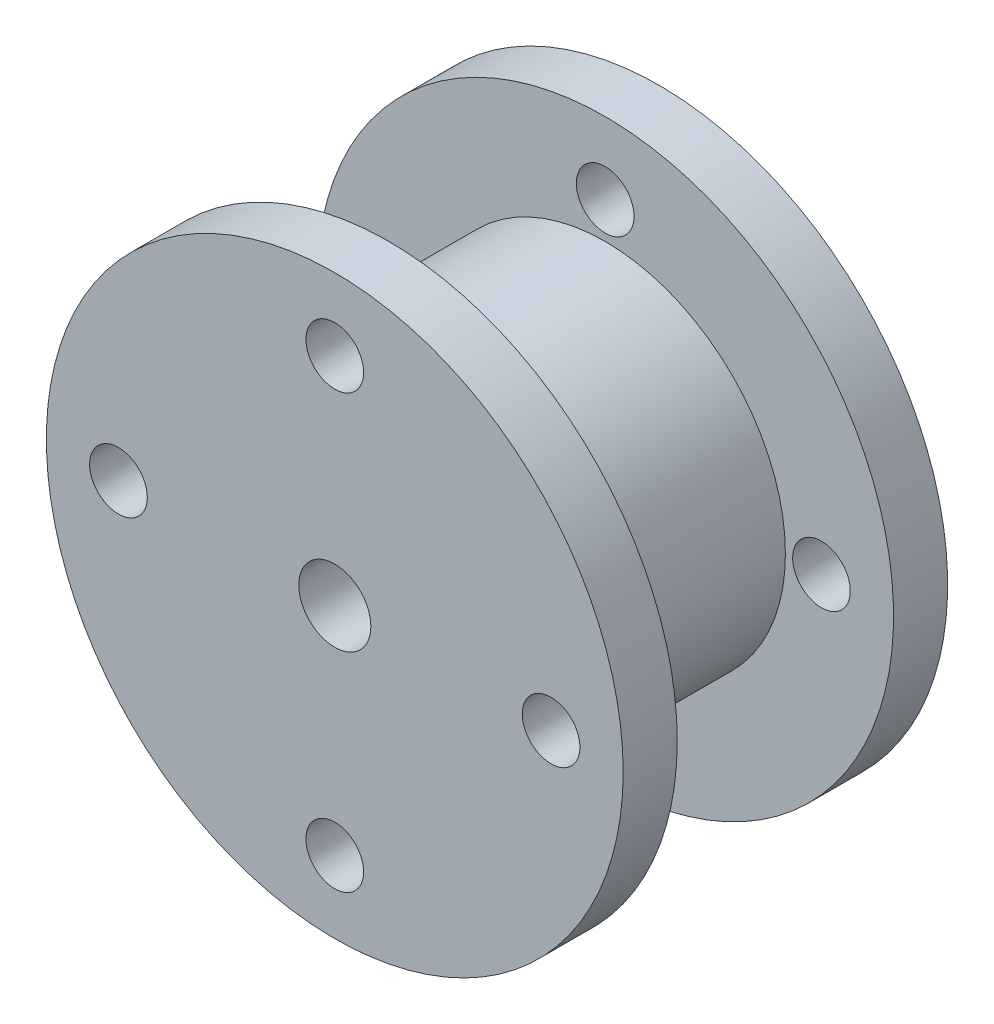
ISO-10303-21;
HEADER;
FILE_DESCRIPTION(('STEP AP214'),'2;1');
FILE_NAME('part.step','',(''),(''),'','','');
FILE_SCHEMA(('AUTOMOTIVE_DESIGN { 1 0 10303 214 1 1 1 1 }'));
ENDSEC;
DATA;
#1=APPLICATION_CONTEXT('core data for automotive mechanical design processes');
#2=APPLICATION_PROTOCOL_DEFINITION('international standard','automotive_design',2000,#1);
#3=PRODUCT_CONTEXT('',#1,'mechanical');
#4=PRODUCT('Part','Part','',(#3));
#5=PRODUCT_RELATED_PRODUCT_CATEGORY('part','',(#4));
#6=PRODUCT_DEFINITION_FORMATION('','',#4);
#7=PRODUCT_DEFINITION_CONTEXT('part definition',#1,'design');
#8=PRODUCT_DEFINITION('design','',#6,#7);
#9=PRODUCT_DEFINITION_SHAPE('','',#8);
#10=(LENGTH_UNIT() NAMED_UNIT(*) SI_UNIT(.MILLI.,.METRE.));
#11=(NAMED_UNIT(*) PLANE_ANGLE_UNIT() SI_UNIT($,.RADIAN.));
#12=(NAMED_UNIT(*) SI_UNIT($,.STERADIAN.) SOLID_ANGLE_UNIT());
#13=UNCERTAINTY_MEASURE_WITH_UNIT(LENGTH_MEASURE(1.E-05),#10,'distance_accuracy_value','');
#14=(GEOMETRIC_REPRESENTATION_CONTEXT(3) GLOBAL_UNCERTAINTY_ASSIGNED_CONTEXT((#13)) GLOBAL_UNIT_ASSIGNED_CONTEXT((#10,
#11,#12)) REPRESENTATION_CONTEXT('',''));
#15=CARTESIAN_POINT('',(0.,0.,0.));
#16=DIRECTION('',(0.,0.,1.));
#17=DIRECTION('',(1.,0.,0.));
#18=AXIS2_PLACEMENT_3D('',#15,#16,#17);
#19=CARTESIAN_POINT('',(0.,0.,6.));
#20=DIRECTION('',(0.,0.,-1.));
#21=DIRECTION('',(-1.,0.,0.));
#22=AXIS2_PLACEMENT_3D('',#19,#20,#21);
#23=CYLINDRICAL_SURFACE('',#22,5.);
#24=CARTESIAN_POINT('',(0.,0.,6.));
#25=DIRECTION('',(0.,0.,1.));
#26=DIRECTION('',(1.,0.,0.));
#27=AXIS2_PLACEMENT_3D('',#24,#25,#26);
#28=CIRCLE('',#27,5.);
#29=CARTESIAN_POINT('',(5.,0.,6.));
#30=VERTEX_POINT('',#29);
#31=EDGE_CURVE('E10',#30,#30,#28,.T.);
#32=ORIENTED_EDGE('',*,*,#31,.F.);
#33=EDGE_LOOP('',(#32));
#34=FACE_BOUND('',#33,.T.);
#35=CARTESIAN_POINT('',(0.,0.,0.));
#36=DIRECTION('',(0.,0.,1.));
#37=DIRECTION('',(1.,0.,0.));
#38=AXIS2_PLACEMENT_3D('',#35,#36,#37);
#39=CIRCLE('',#38,5.);
#40=CARTESIAN_POINT('',(5.,0.,0.));
#41=VERTEX_POINT('',#40);
#42=EDGE_CURVE('E57',#41,#41,#39,.T.);
#43=ORIENTED_EDGE('',*,*,#42,.T.);
#44=EDGE_LOOP('',(#43));
#45=FACE_BOUND('',#44,.T.);
#46=ADVANCED_FACE('F41',(#34,#45),#23,.T.);
#47=CARTESIAN_POINT('',(0.,0.,7.5));
#48=DIRECTION('',(0.,0.,-1.));
#49=DIRECTION('',(-1.,0.,0.));
#50=AXIS2_PLACEMENT_3D('',#47,#48,#49);
#51=CYLINDRICAL_SURFACE('',#50,8.);
#52=CARTESIAN_POINT('',(0.,0.,7.5));
#53=DIRECTION('',(0.,0.,1.));
#54=DIRECTION('',(1.,0.,0.));
#55=AXIS2_PLACEMENT_3D('',#52,#53,#54);
#56=CIRCLE('',#55,8.);
#57=CARTESIAN_POINT('',(8.,0.,7.5));
#58=VERTEX_POINT('',#57);
#59=EDGE_CURVE('E48',#58,#58,#56,.T.);
#60=ORIENTED_EDGE('',*,*,#59,.F.);
#61=EDGE_LOOP('',(#60));
#62=FACE_BOUND('',#61,.T.);
#63=CARTESIAN_POINT('',(0.,0.,6.));
#64=DIRECTION('',(0.,0.,1.));
#65=DIRECTION('',(1.,0.,0.));
#66=AXIS2_PLACEMENT_3D('',#63,#64,#65);
#67=CIRCLE('',#66,8.);
#68=CARTESIAN_POINT('',(8.,0.,6.));
#69=VERTEX_POINT('',#68);
#70=EDGE_CURVE('E53',#69,#69,#67,.T.);
#71=ORIENTED_EDGE('',*,*,#70,.T.);
#72=EDGE_LOOP('',(#71));
#73=FACE_BOUND('',#72,.T.);
#74=ADVANCED_FACE('F123',(#62,#73),#51,.T.);
#75=CARTESIAN_POINT('',(0.,0.,7.5));
#76=DIRECTION('',(0.,0.,1.));
#77=DIRECTION('',(1.,0.,0.));
#78=AXIS2_PLACEMENT_3D('',#75,#76,#77);
#79=PLANE('',#78);
#80=CARTESIAN_POINT('',(0.,0.,7.5));
#81=DIRECTION('',(0.,0.,1.));
#82=DIRECTION('',(1.,0.,0.));
#83=AXIS2_PLACEMENT_3D('',#80,#81,#82);
#84=CIRCLE('',#83,1.);
#85=CARTESIAN_POINT('',(1.,0.,7.5));
#86=VERTEX_POINT('',#85);
#87=EDGE_CURVE('E278',#86,#86,#84,.T.);
#88=ORIENTED_EDGE('',*,*,#87,.F.);
#89=EDGE_LOOP('',(#88));
#90=FACE_BOUND('',#89,.T.);
#91=CARTESIAN_POINT('',(-6.,0.,7.5));
#92=DIRECTION('',(0.,0.,1.));
#93=DIRECTION('',(1.,0.,0.));
#94=AXIS2_PLACEMENT_3D('',#91,#92,#93);
#95=CIRCLE('',#94,0.800000000000001);
#96=CARTESIAN_POINT('',(-5.2,0.,7.5));
#97=VERTEX_POINT('',#96);
#98=EDGE_CURVE('E92',#97,#97,#95,.T.);
#99=ORIENTED_EDGE('',*,*,#98,.F.);
#100=EDGE_LOOP('',(#99));
#101=FACE_BOUND('',#100,.T.);
#102=CARTESIAN_POINT('',(6.,0.,7.5));
#103=DIRECTION('',(0.,0.,1.));
#104=DIRECTION('',(1.,0.,0.));
#105=AXIS2_PLACEMENT_3D('',#102,#103,#104);
#106=CIRCLE('',#105,0.800000000000001);
#107=CARTESIAN_POINT('',(6.8,0.,7.5));
#108=VERTEX_POINT('',#107);
#109=EDGE_CURVE('E77',#108,#108,#106,.T.);
#110=ORIENTED_EDGE('',*,*,#109,.F.);
#111=EDGE_LOOP('',(#110));
#112=FACE_BOUND('',#111,.T.);
#113=CARTESIAN_POINT('',(0.,6.,7.5));
#114=DIRECTION('',(0.,0.,1.));
#115=DIRECTION('',(1.,0.,0.));
#116=AXIS2_PLACEMENT_3D('',#113,#114,#115);
#117=CIRCLE('',#116,0.8);
#118=CARTESIAN_POINT('',(0.8,6.,7.5));
#119=VERTEX_POINT('',#118);
#120=EDGE_CURVE('E73',#119,#119,#117,.T.);
#121=ORIENTED_EDGE('',*,*,#120,.F.);
#122=EDGE_LOOP('',(#121));
#123=FACE_BOUND('',#122,.T.);
#124=CARTESIAN_POINT('',(0.,-6.,7.5));
#125=DIRECTION('',(0.,0.,1.));
#126=DIRECTION('',(1.,0.,0.));
#127=AXIS2_PLACEMENT_3D('',#124,#125,#126);
#128=CIRCLE('',#127,0.8);
#129=CARTESIAN_POINT('',(0.8,-6.,7.5));
#130=VERTEX_POINT('',#129);
#131=EDGE_CURVE('E69',#130,#130,#128,.T.);
#132=ORIENTED_EDGE('',*,*,#131,.F.);
#133=EDGE_LOOP('',(#132));
#134=FACE_BOUND('',#133,.T.);
#135=ORIENTED_EDGE('',*,*,#59,.T.);
#136=EDGE_LOOP('',(#135));
#137=FACE_BOUND('',#136,.T.);
#138=ADVANCED_FACE('F128',(#90,#101,#112,#123,#134,#137),#79,.T.);
#139=CARTESIAN_POINT('',(0.,0.,6.));
#140=DIRECTION('',(0.,0.,1.));
#141=DIRECTION('',(1.,0.,0.));
#142=AXIS2_PLACEMENT_3D('',#139,#140,#141);
#143=PLANE('',#142);
#144=CARTESIAN_POINT('',(-6.,0.,6.));
#145=DIRECTION('',(0.,0.,1.));
#146=DIRECTION('',(1.,0.,0.));
#147=AXIS2_PLACEMENT_3D('',#144,#145,#146);
#148=CIRCLE('',#147,0.800000000000001);
#149=CARTESIAN_POINT('',(-5.2,0.,6.));
#150=VERTEX_POINT('',#149);
#151=EDGE_CURVE('E89',#150,#150,#148,.T.);
#152=ORIENTED_EDGE('',*,*,#151,.T.);
#153=EDGE_LOOP('',(#152));
#154=FACE_BOUND('',#153,.T.);
#155=CARTESIAN_POINT('',(6.,0.,6.));
#156=DIRECTION('',(0.,0.,1.));
#157=DIRECTION('',(1.,0.,0.));
#158=AXIS2_PLACEMENT_3D('',#155,#156,#157);
#159=CIRCLE('',#158,0.800000000000001);
#160=CARTESIAN_POINT('',(6.8,0.,6.));
#161=VERTEX_POINT('',#160);
#162=EDGE_CURVE('E72',#161,#161,#159,.T.);
#163=ORIENTED_EDGE('',*,*,#162,.T.);
#164=EDGE_LOOP('',(#163));
#165=FACE_BOUND('',#164,.T.);
#166=CARTESIAN_POINT('',(0.,6.,6.));
#167=DIRECTION('',(0.,0.,1.));
#168=DIRECTION('',(1.,0.,0.));
#169=AXIS2_PLACEMENT_3D('',#166,#167,#168);
#170=CIRCLE('',#169,0.8);
#171=CARTESIAN_POINT('',(0.8,6.,6.));
#172=VERTEX_POINT('',#171);
#173=EDGE_CURVE('E68',#172,#172,#170,.T.);
#174=ORIENTED_EDGE('',*,*,#173,.T.);
#175=EDGE_LOOP('',(#174));
#176=FACE_BOUND('',#175,.T.);
#177=CARTESIAN_POINT('',(0.,-6.,6.));
#178=DIRECTION('',(0.,0.,1.));
#179=DIRECTION('',(1.,0.,0.));
#180=AXIS2_PLACEMENT_3D('',#177,#178,#179);
#181=CIRCLE('',#180,0.8);
#182=CARTESIAN_POINT('',(0.8,-6.,6.));
#183=VERTEX_POINT('',#182);
#184=EDGE_CURVE('E64',#183,#183,#181,.T.);
#185=ORIENTED_EDGE('',*,*,#184,.T.);
#186=EDGE_LOOP('',(#185));
#187=FACE_BOUND('',#186,.T.);
#188=ORIENTED_EDGE('',*,*,#31,.T.);
#189=EDGE_LOOP('',(#188));
#190=FACE_BOUND('',#189,.T.);
#191=ORIENTED_EDGE('',*,*,#70,.F.);
#192=EDGE_LOOP('',(#191));
#193=FACE_BOUND('',#192,.T.);
#194=ADVANCED_FACE('F137',(#154,#165,#176,#187,#190,#193),#143,.F.);
#195=CARTESIAN_POINT('',(0.,0.,-1.5));
#196=DIRECTION('',(0.,0.,1.));
#197=DIRECTION('',(1.,0.,0.));
#198=AXIS2_PLACEMENT_3D('',#195,#196,#197);
#199=CYLINDRICAL_SURFACE('',#198,8.);
#200=CARTESIAN_POINT('',(0.,0.,-1.5));
#201=DIRECTION('',(0.,0.,-1.));
#202=DIRECTION('',(-1.,0.,0.));
#203=AXIS2_PLACEMENT_3D('',#200,#201,#202);
#204=CIRCLE('',#203,8.);
#205=CARTESIAN_POINT('',(-8.,0.,-1.5));
#206=VERTEX_POINT('',#205);
#207=EDGE_CURVE('E60',#206,#206,#204,.T.);
#208=ORIENTED_EDGE('',*,*,#207,.F.);
#209=EDGE_LOOP('',(#208));
#210=FACE_BOUND('',#209,.T.);
#211=CARTESIAN_POINT('',(0.,0.,0.));
#212=DIRECTION('',(0.,0.,-1.));
#213=DIRECTION('',(-1.,0.,0.));
#214=AXIS2_PLACEMENT_3D('',#211,#212,#213);
#215=CIRCLE('',#214,8.);
#216=CARTESIAN_POINT('',(-8.,0.,0.));
#217=VERTEX_POINT('',#216);
#218=EDGE_CURVE('E95',#217,#217,#215,.T.);
#219=ORIENTED_EDGE('',*,*,#218,.T.);
#220=EDGE_LOOP('',(#219));
#221=FACE_BOUND('',#220,.T.);
#222=ADVANCED_FACE('F101',(#210,#221),#199,.T.);
#223=CARTESIAN_POINT('',(0.,0.,-1.5));
#224=DIRECTION('',(0.,0.,-1.));
#225=DIRECTION('',(-1.,0.,0.));
#226=AXIS2_PLACEMENT_3D('',#223,#224,#225);
#227=PLANE('',#226);
#228=CARTESIAN_POINT('',(0.,0.,-1.5));
#229=DIRECTION('',(0.,0.,1.));
#230=DIRECTION('',(1.,0.,0.));
#231=AXIS2_PLACEMENT_3D('',#228,#229,#230);
#232=CIRCLE('',#231,1.);
#233=CARTESIAN_POINT('',(1.,0.,-1.5));
#234=VERTEX_POINT('',#233);
#235=EDGE_CURVE('E297',#234,#234,#232,.T.);
#236=ORIENTED_EDGE('',*,*,#235,.T.);
#237=EDGE_LOOP('',(#236));
#238=FACE_BOUND('',#237,.T.);
#239=CARTESIAN_POINT('',(-6.,0.,-1.5));
#240=DIRECTION('',(0.,0.,1.));
#241=DIRECTION('',(1.,0.,0.));
#242=AXIS2_PLACEMENT_3D('',#239,#240,#241);
#243=CIRCLE('',#242,0.800000000000001);
#244=CARTESIAN_POINT('',(-5.2,0.,-1.5));
#245=VERTEX_POINT('',#244);
#246=EDGE_CURVE('E65',#245,#245,#243,.T.);
#247=ORIENTED_EDGE('',*,*,#246,.T.);
#248=EDGE_LOOP('',(#247));
#249=FACE_BOUND('',#248,.T.);
#250=CARTESIAN_POINT('',(6.,0.,-1.5));
#251=DIRECTION('',(0.,0.,1.));
#252=DIRECTION('',(-1.,0.,0.));
#253=AXIS2_PLACEMENT_3D('',#250,#251,#252);
#254=CIRCLE('',#253,0.800000000000001);
#255=CARTESIAN_POINT('',(5.2,0.,-1.5));
#256=VERTEX_POINT('',#255);
#257=EDGE_CURVE('E272',#256,#256,#254,.T.);
#258=ORIENTED_EDGE('',*,*,#257,.T.);
#259=EDGE_LOOP('',(#258));
#260=FACE_BOUND('',#259,.T.);
#261=CARTESIAN_POINT('',(0.,6.,-1.5));
#262=DIRECTION('',(0.,0.,1.));
#263=DIRECTION('',(1.,0.,0.));
#264=AXIS2_PLACEMENT_3D('',#261,#262,#263);
#265=CIRCLE('',#264,0.8);
#266=CARTESIAN_POINT('',(0.8,6.,-1.5));
#267=VERTEX_POINT('',#266);
#268=EDGE_CURVE('E265',#267,#267,#265,.T.);
#269=ORIENTED_EDGE('',*,*,#268,.T.);
#270=EDGE_LOOP('',(#269));
#271=FACE_BOUND('',#270,.T.);
#272=CARTESIAN_POINT('',(0.,-6.,-1.5));
#273=DIRECTION('',(0.,0.,1.));
#274=DIRECTION('',(-1.,0.,0.));
#275=AXIS2_PLACEMENT_3D('',#272,#273,#274);
#276=CIRCLE('',#275,0.8);
#277=CARTESIAN_POINT('',(-0.8,-6.,-1.5));
#278=VERTEX_POINT('',#277);
#279=EDGE_CURVE('E273',#278,#278,#276,.T.);
#280=ORIENTED_EDGE('',*,*,#279,.T.);
#281=EDGE_LOOP('',(#280));
#282=FACE_BOUND('',#281,.T.);
#283=ORIENTED_EDGE('',*,*,#207,.T.);
#284=EDGE_LOOP('',(#283));
#285=FACE_BOUND('',#284,.T.);
#286=ADVANCED_FACE('F106',(#238,#249,#260,#271,#282,#285),#227,.T.);
#287=CARTESIAN_POINT('',(0.,0.,0.));
#288=DIRECTION('',(0.,0.,-1.));
#289=DIRECTION('',(-1.,0.,0.));
#290=AXIS2_PLACEMENT_3D('',#287,#288,#289);
#291=PLANE('',#290);
#292=CARTESIAN_POINT('',(-6.,0.,0.));
#293=DIRECTION('',(0.,0.,-1.));
#294=DIRECTION('',(-1.,0.,0.));
#295=AXIS2_PLACEMENT_3D('',#292,#293,#294);
#296=CIRCLE('',#295,0.800000000000001);
#297=CARTESIAN_POINT('',(-6.8,0.,0.));
#298=VERTEX_POINT('',#297);
#299=EDGE_CURVE('E44',#298,#298,#296,.T.);
#300=ORIENTED_EDGE('',*,*,#299,.T.);
#301=EDGE_LOOP('',(#300));
#302=FACE_BOUND('',#301,.T.);
#303=CARTESIAN_POINT('',(6.,0.,0.));
#304=DIRECTION('',(0.,0.,-1.));
#305=DIRECTION('',(-1.,0.,0.));
#306=AXIS2_PLACEMENT_3D('',#303,#304,#305);
#307=CIRCLE('',#306,0.800000000000001);
#308=CARTESIAN_POINT('',(5.2,0.,0.));
#309=VERTEX_POINT('',#308);
#310=EDGE_CURVE('E70',#309,#309,#307,.T.);
#311=ORIENTED_EDGE('',*,*,#310,.T.);
#312=EDGE_LOOP('',(#311));
#313=FACE_BOUND('',#312,.T.);
#314=CARTESIAN_POINT('',(0.,6.,0.));
#315=DIRECTION('',(0.,0.,-1.));
#316=DIRECTION('',(-1.,0.,0.));
#317=AXIS2_PLACEMENT_3D('',#314,#315,#316);
#318=CIRCLE('',#317,0.8);
#319=CARTESIAN_POINT('',(-0.8,6.,0.));
#320=VERTEX_POINT('',#319);
#321=EDGE_CURVE('E66',#320,#320,#318,.T.);
#322=ORIENTED_EDGE('',*,*,#321,.T.);
#323=EDGE_LOOP('',(#322));
#324=FACE_BOUND('',#323,.T.);
#325=CARTESIAN_POINT('',(0.,-6.,0.));
#326=DIRECTION('',(0.,0.,-1.));
#327=DIRECTION('',(-1.,0.,0.));
#328=AXIS2_PLACEMENT_3D('',#325,#326,#327);
#329=CIRCLE('',#328,0.8);
#330=CARTESIAN_POINT('',(-0.8,-6.,0.));
#331=VERTEX_POINT('',#330);
#332=EDGE_CURVE('E61',#331,#331,#329,.T.);
#333=ORIENTED_EDGE('',*,*,#332,.T.);
#334=EDGE_LOOP('',(#333));
#335=FACE_BOUND('',#334,.T.);
#336=ORIENTED_EDGE('',*,*,#42,.F.);
#337=EDGE_LOOP('',(#336));
#338=FACE_BOUND('',#337,.T.);
#339=ORIENTED_EDGE('',*,*,#218,.F.);
#340=EDGE_LOOP('',(#339));
#341=FACE_BOUND('',#340,.T.);
#342=ADVANCED_FACE('F103',(#302,#313,#324,#335,#338,#341),#291,.F.);
#343=CARTESIAN_POINT('',(0.,-6.,-1.5));
#344=DIRECTION('',(0.,0.,1.));
#345=DIRECTION('',(1.,0.,0.));
#346=AXIS2_PLACEMENT_3D('',#343,#344,#345);
#347=CYLINDRICAL_SURFACE('',#346,0.8);
#348=ORIENTED_EDGE('',*,*,#279,.F.);
#349=EDGE_LOOP('',(#348));
#350=FACE_BOUND('',#349,.T.);
#351=ORIENTED_EDGE('',*,*,#332,.F.);
#352=EDGE_LOOP('',(#351));
#353=FACE_BOUND('',#352,.T.);
#354=ADVANCED_FACE('F105',(#350,#353),#347,.F.);
#355=CARTESIAN_POINT('',(0.,6.,-1.5));
#356=DIRECTION('',(0.,0.,1.));
#357=DIRECTION('',(1.,0.,0.));
#358=AXIS2_PLACEMENT_3D('',#355,#356,#357);
#359=CYLINDRICAL_SURFACE('',#358,0.8);
#360=ORIENTED_EDGE('',*,*,#268,.F.);
#361=EDGE_LOOP('',(#360));
#362=FACE_BOUND('',#361,.T.);
#363=ORIENTED_EDGE('',*,*,#321,.F.);
#364=EDGE_LOOP('',(#363));
#365=FACE_BOUND('',#364,.T.);
#366=ADVANCED_FACE('F113',(#362,#365),#359,.F.);
#367=CARTESIAN_POINT('',(6.,0.,-1.5));
#368=DIRECTION('',(0.,0.,1.));
#369=DIRECTION('',(1.,0.,0.));
#370=AXIS2_PLACEMENT_3D('',#367,#368,#369);
#371=CYLINDRICAL_SURFACE('',#370,0.800000000000001);
#372=ORIENTED_EDGE('',*,*,#257,.F.);
#373=EDGE_LOOP('',(#372));
#374=FACE_BOUND('',#373,.T.);
#375=ORIENTED_EDGE('',*,*,#310,.F.);
#376=EDGE_LOOP('',(#375));
#377=FACE_BOUND('',#376,.T.);
#378=ADVANCED_FACE('F208',(#374,#377),#371,.F.);
#379=CARTESIAN_POINT('',(-6.,0.,-1.5));
#380=DIRECTION('',(0.,0.,1.));
#381=DIRECTION('',(1.,0.,0.));
#382=AXIS2_PLACEMENT_3D('',#379,#380,#381);
#383=CYLINDRICAL_SURFACE('',#382,0.800000000000001);
#384=ORIENTED_EDGE('',*,*,#246,.F.);
#385=EDGE_LOOP('',(#384));
#386=FACE_BOUND('',#385,.T.);
#387=ORIENTED_EDGE('',*,*,#299,.F.);
#388=EDGE_LOOP('',(#387));
#389=FACE_BOUND('',#388,.T.);
#390=ADVANCED_FACE('F199',(#386,#389),#383,.F.);
#391=ORIENTED_EDGE('',*,*,#131,.T.);
#392=EDGE_LOOP('',(#391));
#393=FACE_BOUND('',#392,.T.);
#394=ORIENTED_EDGE('',*,*,#184,.F.);
#395=EDGE_LOOP('',(#394));
#396=FACE_BOUND('',#395,.T.);
#397=ADVANCED_FACE('F116',(#393,#396),#347,.F.);
#398=ORIENTED_EDGE('',*,*,#120,.T.);
#399=EDGE_LOOP('',(#398));
#400=FACE_BOUND('',#399,.T.);
#401=ORIENTED_EDGE('',*,*,#173,.F.);
#402=EDGE_LOOP('',(#401));
#403=FACE_BOUND('',#402,.T.);
#404=ADVANCED_FACE('F205',(#400,#403),#359,.F.);
#405=ORIENTED_EDGE('',*,*,#109,.T.);
#406=EDGE_LOOP('',(#405));
#407=FACE_BOUND('',#406,.T.);
#408=ORIENTED_EDGE('',*,*,#162,.F.);
#409=EDGE_LOOP('',(#408));
#410=FACE_BOUND('',#409,.T.);
#411=ADVANCED_FACE('F196',(#407,#410),#371,.F.);
#412=ORIENTED_EDGE('',*,*,#98,.T.);
#413=EDGE_LOOP('',(#412));
#414=FACE_BOUND('',#413,.T.);
#415=ORIENTED_EDGE('',*,*,#151,.F.);
#416=EDGE_LOOP('',(#415));
#417=FACE_BOUND('',#416,.T.);
#418=ADVANCED_FACE('F174',(#414,#417),#383,.F.);
#419=CARTESIAN_POINT('',(0.,0.,-1.5));
#420=DIRECTION('',(0.,0.,1.));
#421=DIRECTION('',(1.,0.,0.));
#422=AXIS2_PLACEMENT_3D('',#419,#420,#421);
#423=CYLINDRICAL_SURFACE('',#422,1.);
#424=ORIENTED_EDGE('',*,*,#87,.T.);
#425=EDGE_LOOP('',(#424));
#426=FACE_BOUND('',#425,.T.);
#427=ORIENTED_EDGE('',*,*,#235,.F.);
#428=EDGE_LOOP('',(#427));
#429=FACE_BOUND('',#428,.T.);
#430=ADVANCED_FACE('F183',(#426,#429),#423,.F.);
#431=CLOSED_SHELL('',(#46,#74,#138,#194,#222,#286,#342,#354,#366,#378,#390,#397,#404,#411,#418,#430));
#432=MANIFOLD_SOLID_BREP('B2',#431);
#433=ADVANCED_BREP_SHAPE_REPRESENTATION('',(#18,#432),#14);
#434=SHAPE_DEFINITION_REPRESENTATION(#9,#433);
ENDSEC;
END-ISO-10303-21;
